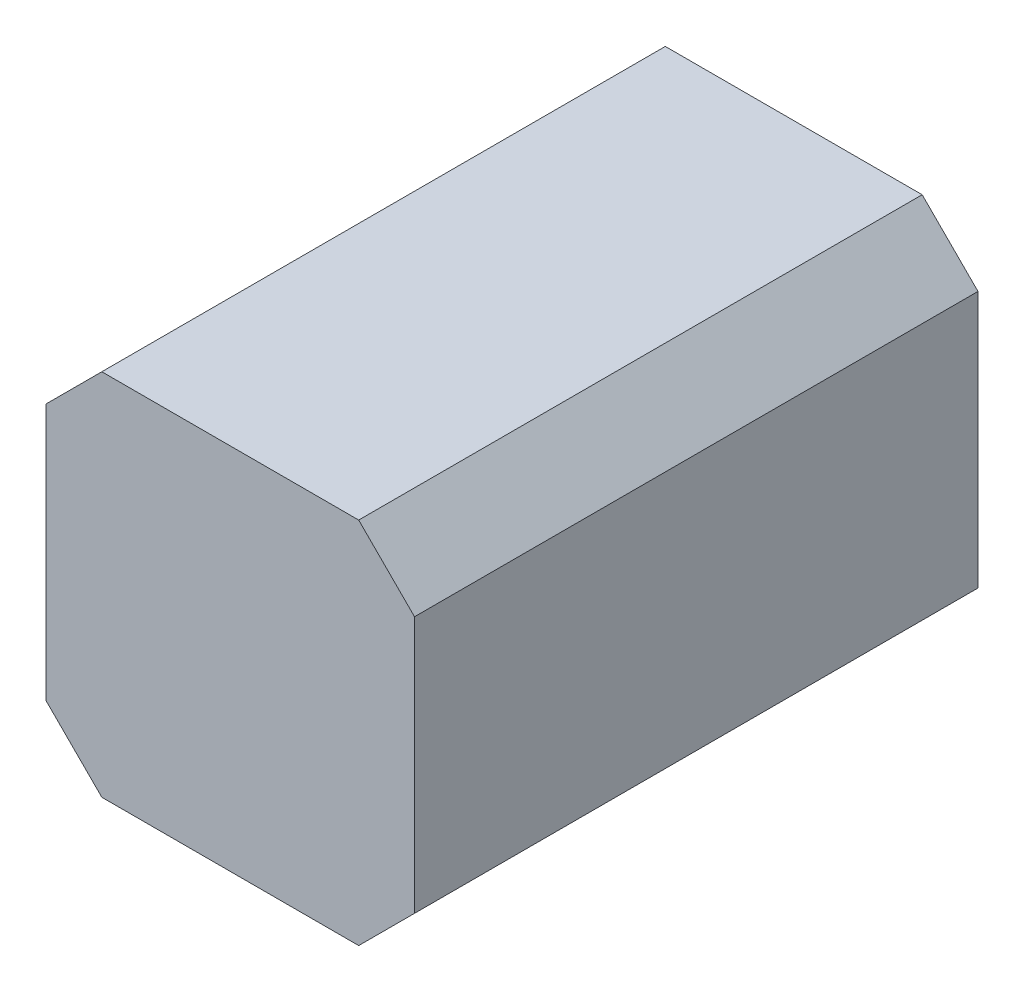
ISO-10303-21;
HEADER;
FILE_DESCRIPTION(('STEP AP214'),'2;1');
FILE_NAME('part.step','',(''),(''),'','','');
FILE_SCHEMA(('AUTOMOTIVE_DESIGN { 1 0 10303 214 1 1 1 1 }'));
ENDSEC;
DATA;
#1=APPLICATION_CONTEXT('core data for automotive mechanical design processes');
#2=APPLICATION_PROTOCOL_DEFINITION('international standard','automotive_design',2000,#1);
#3=PRODUCT_CONTEXT('',#1,'mechanical');
#4=PRODUCT('Part','Part','',(#3));
#5=PRODUCT_RELATED_PRODUCT_CATEGORY('part','',(#4));
#6=PRODUCT_DEFINITION_FORMATION('','',#4);
#7=PRODUCT_DEFINITION_CONTEXT('part definition',#1,'design');
#8=PRODUCT_DEFINITION('design','',#6,#7);
#9=PRODUCT_DEFINITION_SHAPE('','',#8);
#10=(LENGTH_UNIT() NAMED_UNIT(*) SI_UNIT(.MILLI.,.METRE.));
#11=(NAMED_UNIT(*) PLANE_ANGLE_UNIT() SI_UNIT($,.RADIAN.));
#12=(NAMED_UNIT(*) SI_UNIT($,.STERADIAN.) SOLID_ANGLE_UNIT());
#13=UNCERTAINTY_MEASURE_WITH_UNIT(LENGTH_MEASURE(1.E-05),#10,'distance_accuracy_value','');
#14=(GEOMETRIC_REPRESENTATION_CONTEXT(3) GLOBAL_UNCERTAINTY_ASSIGNED_CONTEXT((#13)) GLOBAL_UNIT_ASSIGNED_CONTEXT((#10,
#11,#12)) REPRESENTATION_CONTEXT('',''));
#15=CARTESIAN_POINT('',(0.,0.,0.));
#16=DIRECTION('',(0.,0.,1.));
#17=DIRECTION('',(1.,0.,0.));
#18=AXIS2_PLACEMENT_3D('',#15,#16,#17);
#19=CARTESIAN_POINT('',(-50.063160108008,-50.0631601080071,180.425806451613));
#20=DIRECTION('',(-0.707106781186554,-0.707106781186541,0.));
#21=DIRECTION('',(0.707106781186541,-0.707106781186554,0.));
#22=AXIS2_PLACEMENT_3D('',#19,#20,#21);
#23=PLANE('',#22);
#24=DIRECTION('',(-0.707106781186541,0.707106781186555,0.));
#25=VECTOR('',#24,1.);
#26=CARTESIAN_POINT('',(-50.063160108008,-50.0631601080071,0.));
#27=LINE('',#26,#25);
#28=CARTESIAN_POINT('',(-41.1263202160153,-59.,0.));
#29=VERTEX_POINT('',#28);
#30=CARTESIAN_POINT('',(-59.,-41.1263202160149,0.));
#31=VERTEX_POINT('',#30);
#32=EDGE_CURVE('E130',#29,#31,#27,.T.);
#33=ORIENTED_EDGE('',*,*,#32,.F.);
#34=DIRECTION('',(0.,0.,-1.));
#35=VECTOR('',#34,1.);
#36=CARTESIAN_POINT('',(-41.1263202160153,-59.,180.425806451613));
#37=LINE('',#36,#35);
#38=CARTESIAN_POINT('',(-41.1263202160153,-59.,180.425806451613));
#39=VERTEX_POINT('',#38);
#40=EDGE_CURVE('E11',#39,#29,#37,.T.);
#41=ORIENTED_EDGE('',*,*,#40,.F.);
#42=DIRECTION('',(-0.707106781186541,0.707106781186555,0.));
#43=VECTOR('',#42,1.);
#44=CARTESIAN_POINT('',(-50.063160108008,-50.0631601080071,180.425806451613));
#45=LINE('',#44,#43);
#46=CARTESIAN_POINT('',(-59.,-41.1263202160149,180.425806451613));
#47=VERTEX_POINT('',#46);
#48=EDGE_CURVE('E150',#39,#47,#45,.T.);
#49=ORIENTED_EDGE('',*,*,#48,.T.);
#50=DIRECTION('',(0.,0.,-1.));
#51=VECTOR('',#50,1.);
#52=CARTESIAN_POINT('',(-59.,-41.1263202160149,180.425806451613));
#53=LINE('',#52,#51);
#54=EDGE_CURVE('E53',#47,#31,#53,.T.);
#55=ORIENTED_EDGE('',*,*,#54,.T.);
#56=EDGE_LOOP('',(#33,#41,#49,#55));
#57=FACE_BOUND('',#56,.T.);
#58=ADVANCED_FACE('F37',(#57),#23,.T.);
#59=CARTESIAN_POINT('',(0.,-59.,180.425806451613));
#60=DIRECTION('',(0.,1.,0.));
#61=DIRECTION('',(0.,0.,1.));
#62=AXIS2_PLACEMENT_3D('',#59,#60,#61);
#63=PLANE('',#62);
#64=DIRECTION('',(1.,0.,0.));
#65=VECTOR('',#64,1.);
#66=CARTESIAN_POINT('',(0.,-59.,0.));
#67=LINE('',#66,#65);
#68=CARTESIAN_POINT('',(41.126320216015,-59.,0.));
#69=VERTEX_POINT('',#68);
#70=EDGE_CURVE('E132',#29,#69,#67,.T.);
#71=ORIENTED_EDGE('',*,*,#70,.T.);
#72=DIRECTION('',(0.,0.,-1.));
#73=VECTOR('',#72,1.);
#74=CARTESIAN_POINT('',(41.126320216015,-59.,180.425806451613));
#75=LINE('',#74,#73);
#76=CARTESIAN_POINT('',(41.126320216015,-59.,180.425806451613));
#77=VERTEX_POINT('',#76);
#78=EDGE_CURVE('E45',#77,#69,#75,.T.);
#79=ORIENTED_EDGE('',*,*,#78,.F.);
#80=DIRECTION('',(1.,0.,0.));
#81=VECTOR('',#80,1.);
#82=CARTESIAN_POINT('',(0.,-59.,180.425806451613));
#83=LINE('',#82,#81);
#84=EDGE_CURVE('E177',#39,#77,#83,.T.);
#85=ORIENTED_EDGE('',*,*,#84,.F.);
#86=ORIENTED_EDGE('',*,*,#40,.T.);
#87=EDGE_LOOP('',(#71,#79,#85,#86));
#88=FACE_BOUND('',#87,.T.);
#89=ADVANCED_FACE('F166',(#88),#63,.F.);
#90=CARTESIAN_POINT('',(50.0631601080072,-50.0631601080079,180.425806451613));
#91=DIRECTION('',(0.707106781186543,-0.707106781186552,0.));
#92=DIRECTION('',(0.707106781186552,0.707106781186543,0.));
#93=AXIS2_PLACEMENT_3D('',#90,#91,#92);
#94=PLANE('',#93);
#95=DIRECTION('',(-0.707106781186552,-0.707106781186543,0.));
#96=VECTOR('',#95,1.);
#97=CARTESIAN_POINT('',(50.0631601080072,-50.0631601080079,0.));
#98=LINE('',#97,#96);
#99=CARTESIAN_POINT('',(59.,-41.1263202160152,0.));
#100=VERTEX_POINT('',#99);
#101=EDGE_CURVE('E135',#100,#69,#98,.T.);
#102=ORIENTED_EDGE('',*,*,#101,.F.);
#103=DIRECTION('',(0.,0.,-1.));
#104=VECTOR('',#103,1.);
#105=CARTESIAN_POINT('',(59.,-41.1263202160152,180.425806451613));
#106=LINE('',#105,#104);
#107=CARTESIAN_POINT('',(59.,-41.1263202160152,180.425806451613));
#108=VERTEX_POINT('',#107);
#109=EDGE_CURVE('E156',#108,#100,#106,.T.);
#110=ORIENTED_EDGE('',*,*,#109,.F.);
#111=DIRECTION('',(-0.707106781186552,-0.707106781186543,0.));
#112=VECTOR('',#111,1.);
#113=CARTESIAN_POINT('',(50.0631601080072,-50.0631601080079,180.425806451613));
#114=LINE('',#113,#112);
#115=EDGE_CURVE('E163',#108,#77,#114,.T.);
#116=ORIENTED_EDGE('',*,*,#115,.T.);
#117=ORIENTED_EDGE('',*,*,#78,.T.);
#118=EDGE_LOOP('',(#102,#110,#116,#117));
#119=FACE_BOUND('',#118,.T.);
#120=ADVANCED_FACE('F161',(#119),#94,.T.);
#121=CARTESIAN_POINT('',(59.,0.,180.425806451613));
#122=DIRECTION('',(-1.,0.,0.));
#123=DIRECTION('',(0.,0.,1.));
#124=AXIS2_PLACEMENT_3D('',#121,#122,#123);
#125=PLANE('',#124);
#126=DIRECTION('',(0.,1.,0.));
#127=VECTOR('',#126,1.);
#128=CARTESIAN_POINT('',(59.,0.,0.));
#129=LINE('',#128,#127);
#130=CARTESIAN_POINT('',(59.,41.1263202160151,0.));
#131=VERTEX_POINT('',#130);
#132=EDGE_CURVE('E138',#100,#131,#129,.T.);
#133=ORIENTED_EDGE('',*,*,#132,.T.);
#134=DIRECTION('',(0.,0.,-1.));
#135=VECTOR('',#134,1.);
#136=CARTESIAN_POINT('',(59.,41.1263202160151,180.425806451613));
#137=LINE('',#136,#135);
#138=CARTESIAN_POINT('',(59.,41.1263202160151,180.425806451613));
#139=VERTEX_POINT('',#138);
#140=EDGE_CURVE('E154',#139,#131,#137,.T.);
#141=ORIENTED_EDGE('',*,*,#140,.F.);
#142=DIRECTION('',(0.,1.,0.));
#143=VECTOR('',#142,1.);
#144=CARTESIAN_POINT('',(59.,0.,180.425806451613));
#145=LINE('',#144,#143);
#146=EDGE_CURVE('E175',#108,#139,#145,.T.);
#147=ORIENTED_EDGE('',*,*,#146,.F.);
#148=ORIENTED_EDGE('',*,*,#109,.T.);
#149=EDGE_LOOP('',(#133,#141,#147,#148));
#150=FACE_BOUND('',#149,.T.);
#151=ADVANCED_FACE('F173',(#150),#125,.F.);
#152=CARTESIAN_POINT('',(50.0631601080077,50.0631601080074,180.425806451613));
#153=DIRECTION('',(0.707106781186549,0.707106781186546,0.));
#154=DIRECTION('',(-0.707106781186546,0.707106781186549,0.));
#155=AXIS2_PLACEMENT_3D('',#152,#153,#154);
#156=PLANE('',#155);
#157=DIRECTION('',(0.707106781186546,-0.707106781186549,0.));
#158=VECTOR('',#157,1.);
#159=CARTESIAN_POINT('',(50.0631601080077,50.0631601080074,0.));
#160=LINE('',#159,#158);
#161=CARTESIAN_POINT('',(41.1263202160152,59.,0.));
#162=VERTEX_POINT('',#161);
#163=EDGE_CURVE('E141',#162,#131,#160,.T.);
#164=ORIENTED_EDGE('',*,*,#163,.F.);
#165=DIRECTION('',(0.,0.,-1.));
#166=VECTOR('',#165,1.);
#167=CARTESIAN_POINT('',(41.1263202160152,59.,180.425806451613));
#168=LINE('',#167,#166);
#169=CARTESIAN_POINT('',(41.1263202160152,59.,180.425806451613));
#170=VERTEX_POINT('',#169);
#171=EDGE_CURVE('E112',#170,#162,#168,.T.);
#172=ORIENTED_EDGE('',*,*,#171,.F.);
#173=DIRECTION('',(0.707106781186546,-0.707106781186549,0.));
#174=VECTOR('',#173,1.);
#175=CARTESIAN_POINT('',(50.0631601080077,50.0631601080074,180.425806451613));
#176=LINE('',#175,#174);
#177=EDGE_CURVE('E122',#170,#139,#176,.T.);
#178=ORIENTED_EDGE('',*,*,#177,.T.);
#179=ORIENTED_EDGE('',*,*,#140,.T.);
#180=EDGE_LOOP('',(#164,#172,#178,#179));
#181=FACE_BOUND('',#180,.T.);
#182=ADVANCED_FACE('F182',(#181),#156,.T.);
#183=CARTESIAN_POINT('',(0.,59.,180.425806451613));
#184=DIRECTION('',(0.,1.,0.));
#185=DIRECTION('',(0.,0.,1.));
#186=AXIS2_PLACEMENT_3D('',#183,#184,#185);
#187=PLANE('',#186);
#188=DIRECTION('',(1.,0.,0.));
#189=VECTOR('',#188,1.);
#190=CARTESIAN_POINT('',(0.,59.,0.));
#191=LINE('',#190,#189);
#192=CARTESIAN_POINT('',(-41.1263202160151,59.,0.));
#193=VERTEX_POINT('',#192);
#194=EDGE_CURVE('E108',#193,#162,#191,.T.);
#195=ORIENTED_EDGE('',*,*,#194,.F.);
#196=DIRECTION('',(0.,0.,-1.));
#197=VECTOR('',#196,1.);
#198=CARTESIAN_POINT('',(-41.1263202160151,59.,180.425806451613));
#199=LINE('',#198,#197);
#200=CARTESIAN_POINT('',(-41.1263202160151,59.,180.425806451613));
#201=VERTEX_POINT('',#200);
#202=EDGE_CURVE('E103',#201,#193,#199,.T.);
#203=ORIENTED_EDGE('',*,*,#202,.F.);
#204=DIRECTION('',(1.,0.,0.));
#205=VECTOR('',#204,1.);
#206=CARTESIAN_POINT('',(0.,59.,180.425806451613));
#207=LINE('',#206,#205);
#208=EDGE_CURVE('E106',#201,#170,#207,.T.);
#209=ORIENTED_EDGE('',*,*,#208,.T.);
#210=ORIENTED_EDGE('',*,*,#171,.T.);
#211=EDGE_LOOP('',(#195,#203,#209,#210));
#212=FACE_BOUND('',#211,.T.);
#213=ADVANCED_FACE('F105',(#212),#187,.T.);
#214=CARTESIAN_POINT('',(-50.0631601080076,50.0631601080075,180.425806451613));
#215=DIRECTION('',(-0.707106781186548,0.707106781186547,0.));
#216=DIRECTION('',(-0.707106781186547,-0.707106781186548,0.));
#217=AXIS2_PLACEMENT_3D('',#214,#215,#216);
#218=PLANE('',#217);
#219=DIRECTION('',(0.707106781186547,0.707106781186548,0.));
#220=VECTOR('',#219,1.);
#221=CARTESIAN_POINT('',(-50.0631601080076,50.0631601080075,0.));
#222=LINE('',#221,#220);
#223=CARTESIAN_POINT('',(-59.,41.1263202160151,0.));
#224=VERTEX_POINT('',#223);
#225=EDGE_CURVE('E145',#224,#193,#222,.T.);
#226=ORIENTED_EDGE('',*,*,#225,.F.);
#227=DIRECTION('',(0.,0.,-1.));
#228=VECTOR('',#227,1.);
#229=CARTESIAN_POINT('',(-59.,41.1263202160151,180.425806451613));
#230=LINE('',#229,#228);
#231=CARTESIAN_POINT('',(-59.,41.1263202160151,180.425806451613));
#232=VERTEX_POINT('',#231);
#233=EDGE_CURVE('E78',#232,#224,#230,.T.);
#234=ORIENTED_EDGE('',*,*,#233,.F.);
#235=DIRECTION('',(0.707106781186547,0.707106781186548,0.));
#236=VECTOR('',#235,1.);
#237=CARTESIAN_POINT('',(-50.0631601080076,50.0631601080075,180.425806451613));
#238=LINE('',#237,#236);
#239=EDGE_CURVE('E120',#232,#201,#238,.T.);
#240=ORIENTED_EDGE('',*,*,#239,.T.);
#241=ORIENTED_EDGE('',*,*,#202,.T.);
#242=EDGE_LOOP('',(#226,#234,#240,#241));
#243=FACE_BOUND('',#242,.T.);
#244=ADVANCED_FACE('F124',(#243),#218,.T.);
#245=CARTESIAN_POINT('',(-59.,0.,180.425806451613));
#246=DIRECTION('',(-1.,0.,0.));
#247=DIRECTION('',(0.,0.,1.));
#248=AXIS2_PLACEMENT_3D('',#245,#246,#247);
#249=PLANE('',#248);
#250=DIRECTION('',(0.,1.,0.));
#251=VECTOR('',#250,1.);
#252=CARTESIAN_POINT('',(-59.,0.,0.));
#253=LINE('',#252,#251);
#254=EDGE_CURVE('E147',#31,#224,#253,.T.);
#255=ORIENTED_EDGE('',*,*,#254,.F.);
#256=ORIENTED_EDGE('',*,*,#54,.F.);
#257=DIRECTION('',(0.,1.,0.));
#258=VECTOR('',#257,1.);
#259=CARTESIAN_POINT('',(-59.,0.,180.425806451613));
#260=LINE('',#259,#258);
#261=EDGE_CURVE('E125',#47,#232,#260,.T.);
#262=ORIENTED_EDGE('',*,*,#261,.T.);
#263=ORIENTED_EDGE('',*,*,#233,.T.);
#264=EDGE_LOOP('',(#255,#256,#262,#263));
#265=FACE_BOUND('',#264,.T.);
#266=ADVANCED_FACE('F183',(#265),#249,.T.);
#267=CARTESIAN_POINT('',(0.,0.,180.425806451613));
#268=DIRECTION('',(0.,0.,1.));
#269=DIRECTION('',(1.,0.,0.));
#270=AXIS2_PLACEMENT_3D('',#267,#268,#269);
#271=PLANE('',#270);
#272=ORIENTED_EDGE('',*,*,#48,.F.);
#273=ORIENTED_EDGE('',*,*,#84,.T.);
#274=ORIENTED_EDGE('',*,*,#115,.F.);
#275=ORIENTED_EDGE('',*,*,#146,.T.);
#276=ORIENTED_EDGE('',*,*,#177,.F.);
#277=ORIENTED_EDGE('',*,*,#208,.F.);
#278=ORIENTED_EDGE('',*,*,#239,.F.);
#279=ORIENTED_EDGE('',*,*,#261,.F.);
#280=EDGE_LOOP('',(#272,#273,#274,#275,#276,#277,#278,#279));
#281=FACE_BOUND('',#280,.T.);
#282=ADVANCED_FACE('F118',(#281),#271,.T.);
#283=CARTESIAN_POINT('',(0.,0.,0.));
#284=DIRECTION('',(0.,0.,1.));
#285=DIRECTION('',(1.,0.,0.));
#286=AXIS2_PLACEMENT_3D('',#283,#284,#285);
#287=PLANE('',#286);
#288=ORIENTED_EDGE('',*,*,#32,.T.);
#289=ORIENTED_EDGE('',*,*,#254,.T.);
#290=ORIENTED_EDGE('',*,*,#225,.T.);
#291=ORIENTED_EDGE('',*,*,#194,.T.);
#292=ORIENTED_EDGE('',*,*,#163,.T.);
#293=ORIENTED_EDGE('',*,*,#132,.F.);
#294=ORIENTED_EDGE('',*,*,#101,.T.);
#295=ORIENTED_EDGE('',*,*,#70,.F.);
#296=EDGE_LOOP('',(#288,#289,#290,#291,#292,#293,#294,#295));
#297=FACE_BOUND('',#296,.T.);
#298=ADVANCED_FACE('F169',(#297),#287,.F.);
#299=CLOSED_SHELL('',(#58,#89,#120,#151,#182,#213,#244,#266,#282,#298));
#300=MANIFOLD_SOLID_BREP('B2',#299);
#301=ADVANCED_BREP_SHAPE_REPRESENTATION('',(#18,#300),#14);
#302=SHAPE_DEFINITION_REPRESENTATION(#9,#301);
ENDSEC;
END-ISO-10303-21;
